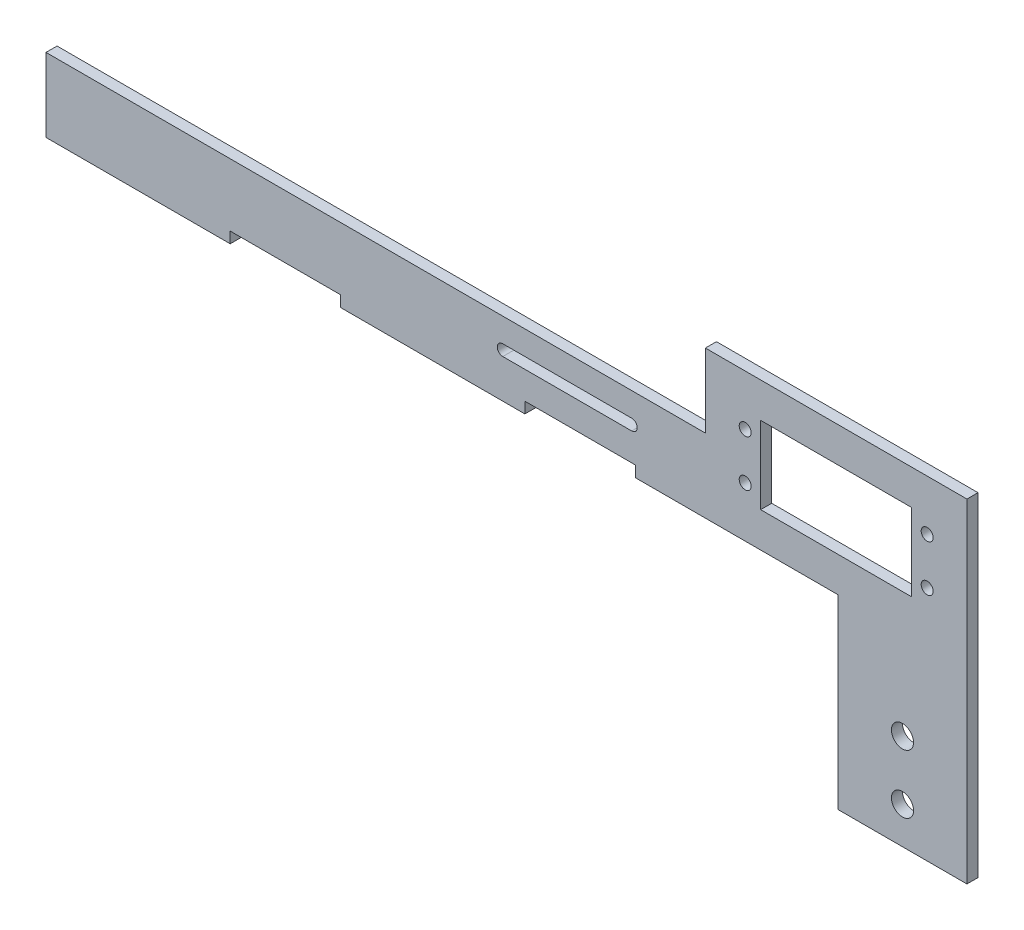
ISO-10303-21;
HEADER;
FILE_DESCRIPTION(('STEP AP214'),'2;1');
FILE_NAME('part.step','',(''),(''),'','','');
FILE_SCHEMA(('AUTOMOTIVE_DESIGN { 1 0 10303 214 1 1 1 1 }'));
ENDSEC;
DATA;
#1=APPLICATION_CONTEXT('core data for automotive mechanical design processes');
#2=APPLICATION_PROTOCOL_DEFINITION('international standard','automotive_design',2000,#1);
#3=PRODUCT_CONTEXT('',#1,'mechanical');
#4=PRODUCT('Part','Part','',(#3));
#5=PRODUCT_RELATED_PRODUCT_CATEGORY('part','',(#4));
#6=PRODUCT_DEFINITION_FORMATION('','',#4);
#7=PRODUCT_DEFINITION_CONTEXT('part definition',#1,'design');
#8=PRODUCT_DEFINITION('design','',#6,#7);
#9=PRODUCT_DEFINITION_SHAPE('','',#8);
#10=(LENGTH_UNIT() NAMED_UNIT(*) SI_UNIT(.MILLI.,.METRE.));
#11=(NAMED_UNIT(*) PLANE_ANGLE_UNIT() SI_UNIT($,.RADIAN.));
#12=(NAMED_UNIT(*) SI_UNIT($,.STERADIAN.) SOLID_ANGLE_UNIT());
#13=UNCERTAINTY_MEASURE_WITH_UNIT(LENGTH_MEASURE(1.E-05),#10,'distance_accuracy_value','');
#14=(GEOMETRIC_REPRESENTATION_CONTEXT(3) GLOBAL_UNCERTAINTY_ASSIGNED_CONTEXT((#13)) GLOBAL_UNIT_ASSIGNED_CONTEXT((#10,
#11,#12)) REPRESENTATION_CONTEXT('',''));
#15=CARTESIAN_POINT('',(0.,0.,0.));
#16=DIRECTION('',(0.,0.,1.));
#17=DIRECTION('',(1.,0.,0.));
#18=AXIS2_PLACEMENT_3D('',#15,#16,#17);
#19=CARTESIAN_POINT('',(0.,10.5,3.));
#20=DIRECTION('',(0.,1.,0.));
#21=DIRECTION('',(0.,0.,1.));
#22=AXIS2_PLACEMENT_3D('',#19,#20,#21);
#23=PLANE('',#22);
#24=DIRECTION('',(1.,0.,0.));
#25=VECTOR('',#24,1.);
#26=CARTESIAN_POINT('',(0.,10.5,0.));
#27=LINE('',#26,#25);
#28=CARTESIAN_POINT('',(194.,10.5,0.));
#29=VERTEX_POINT('',#28);
#30=CARTESIAN_POINT('',(235.,10.5,0.));
#31=VERTEX_POINT('',#30);
#32=EDGE_CURVE('E306',#29,#31,#27,.T.);
#33=ORIENTED_EDGE('',*,*,#32,.T.);
#34=DIRECTION('',(0.,0.,-1.));
#35=VECTOR('',#34,1.);
#36=CARTESIAN_POINT('',(235.,10.5,3.));
#37=LINE('',#36,#35);
#38=CARTESIAN_POINT('',(235.,10.5,3.));
#39=VERTEX_POINT('',#38);
#40=EDGE_CURVE('E11',#39,#31,#37,.T.);
#41=ORIENTED_EDGE('',*,*,#40,.F.);
#42=DIRECTION('',(1.,0.,0.));
#43=VECTOR('',#42,1.);
#44=CARTESIAN_POINT('',(0.,10.5,3.));
#45=LINE('',#44,#43);
#46=CARTESIAN_POINT('',(194.,10.5,3.));
#47=VERTEX_POINT('',#46);
#48=EDGE_CURVE('E211',#47,#39,#45,.T.);
#49=ORIENTED_EDGE('',*,*,#48,.F.);
#50=DIRECTION('',(0.,0.,-1.));
#51=VECTOR('',#50,1.);
#52=CARTESIAN_POINT('',(194.,10.5,3.));
#53=LINE('',#52,#51);
#54=EDGE_CURVE('E54',#47,#29,#53,.T.);
#55=ORIENTED_EDGE('',*,*,#54,.T.);
#56=EDGE_LOOP('',(#33,#41,#49,#55));
#57=FACE_BOUND('',#56,.T.);
#58=ADVANCED_FACE('F35',(#57),#23,.F.);
#59=CARTESIAN_POINT('',(235.,0.,3.));
#60=DIRECTION('',(1.,0.,0.));
#61=DIRECTION('',(0.,0.,-1.));
#62=AXIS2_PLACEMENT_3D('',#59,#60,#61);
#63=PLANE('',#62);
#64=DIRECTION('',(0.,-1.,0.));
#65=VECTOR('',#64,1.);
#66=CARTESIAN_POINT('',(235.,0.,0.));
#67=LINE('',#66,#65);
#68=CARTESIAN_POINT('',(235.,-10.5,0.));
#69=VERTEX_POINT('',#68);
#70=EDGE_CURVE('E217',#31,#69,#67,.T.);
#71=ORIENTED_EDGE('',*,*,#70,.T.);
#72=DIRECTION('',(0.,0.,-1.));
#73=VECTOR('',#72,1.);
#74=CARTESIAN_POINT('',(235.,-10.5,3.));
#75=LINE('',#74,#73);
#76=CARTESIAN_POINT('',(235.,-10.5,3.));
#77=VERTEX_POINT('',#76);
#78=EDGE_CURVE('E45',#77,#69,#75,.T.);
#79=ORIENTED_EDGE('',*,*,#78,.F.);
#80=DIRECTION('',(0.,-1.,0.));
#81=VECTOR('',#80,1.);
#82=CARTESIAN_POINT('',(235.,0.,3.));
#83=LINE('',#82,#81);
#84=EDGE_CURVE('E204',#39,#77,#83,.T.);
#85=ORIENTED_EDGE('',*,*,#84,.F.);
#86=ORIENTED_EDGE('',*,*,#40,.T.);
#87=EDGE_LOOP('',(#71,#79,#85,#86));
#88=FACE_BOUND('',#87,.T.);
#89=ADVANCED_FACE('F216',(#88),#63,.F.);
#90=CARTESIAN_POINT('',(0.,-10.5,3.));
#91=DIRECTION('',(0.,1.,0.));
#92=DIRECTION('',(0.,0.,1.));
#93=AXIS2_PLACEMENT_3D('',#90,#91,#92);
#94=PLANE('',#93);
#95=DIRECTION('',(1.,0.,0.));
#96=VECTOR('',#95,1.);
#97=CARTESIAN_POINT('',(0.,-10.5,0.));
#98=LINE('',#97,#96);
#99=CARTESIAN_POINT('',(194.,-10.5,0.));
#100=VERTEX_POINT('',#99);
#101=EDGE_CURVE('E309',#100,#69,#98,.T.);
#102=ORIENTED_EDGE('',*,*,#101,.F.);
#103=DIRECTION('',(0.,0.,-1.));
#104=VECTOR('',#103,1.);
#105=CARTESIAN_POINT('',(194.,-10.5,3.));
#106=LINE('',#105,#104);
#107=CARTESIAN_POINT('',(194.,-10.5,3.));
#108=VERTEX_POINT('',#107);
#109=EDGE_CURVE('E128',#108,#100,#106,.T.);
#110=ORIENTED_EDGE('',*,*,#109,.F.);
#111=DIRECTION('',(1.,0.,0.));
#112=VECTOR('',#111,1.);
#113=CARTESIAN_POINT('',(0.,-10.5,3.));
#114=LINE('',#113,#112);
#115=EDGE_CURVE('E210',#108,#77,#114,.T.);
#116=ORIENTED_EDGE('',*,*,#115,.T.);
#117=ORIENTED_EDGE('',*,*,#78,.T.);
#118=EDGE_LOOP('',(#102,#110,#116,#117));
#119=FACE_BOUND('',#118,.T.);
#120=ADVANCED_FACE('F221',(#119),#94,.T.);
#121=CARTESIAN_POINT('',(250.,0.,3.));
#122=DIRECTION('',(1.,0.,0.));
#123=DIRECTION('',(0.,0.,-1.));
#124=AXIS2_PLACEMENT_3D('',#121,#122,#123);
#125=PLANE('',#124);
#126=DIRECTION('',(0.,-1.,0.));
#127=VECTOR('',#126,1.);
#128=CARTESIAN_POINT('',(250.,0.,0.));
#129=LINE('',#128,#127);
#130=CARTESIAN_POINT('',(250.,20.,0.));
#131=VERTEX_POINT('',#130);
#132=CARTESIAN_POINT('',(250.,-70.5,0.));
#133=VERTEX_POINT('',#132);
#134=EDGE_CURVE('E258',#131,#133,#129,.T.);
#135=ORIENTED_EDGE('',*,*,#134,.F.);
#136=DIRECTION('',(0.,0.,-1.));
#137=VECTOR('',#136,1.);
#138=CARTESIAN_POINT('',(250.,20.,3.));
#139=LINE('',#138,#137);
#140=CARTESIAN_POINT('',(250.,20.,3.));
#141=VERTEX_POINT('',#140);
#142=EDGE_CURVE('E322',#141,#131,#139,.T.);
#143=ORIENTED_EDGE('',*,*,#142,.F.);
#144=DIRECTION('',(0.,-1.,0.));
#145=VECTOR('',#144,1.);
#146=CARTESIAN_POINT('',(250.,0.,3.));
#147=LINE('',#146,#145);
#148=CARTESIAN_POINT('',(250.,-70.5,3.));
#149=VERTEX_POINT('',#148);
#150=EDGE_CURVE('E399',#141,#149,#147,.T.);
#151=ORIENTED_EDGE('',*,*,#150,.T.);
#152=DIRECTION('',(0.,0.,-1.));
#153=VECTOR('',#152,1.);
#154=CARTESIAN_POINT('',(250.,-70.5,3.));
#155=LINE('',#154,#153);
#156=EDGE_CURVE('E324',#149,#133,#155,.T.);
#157=ORIENTED_EDGE('',*,*,#156,.T.);
#158=EDGE_LOOP('',(#135,#143,#151,#157));
#159=FACE_BOUND('',#158,.T.);
#160=ADVANCED_FACE('F452',(#159),#125,.T.);
#161=CARTESIAN_POINT('',(0.,20.,3.));
#162=DIRECTION('',(0.,-1.,0.));
#163=DIRECTION('',(1.,0.,0.));
#164=AXIS2_PLACEMENT_3D('',#161,#162,#163);
#165=PLANE('',#164);
#166=DIRECTION('',(-1.,0.,0.));
#167=VECTOR('',#166,1.);
#168=CARTESIAN_POINT('',(0.,20.,0.));
#169=LINE('',#168,#167);
#170=CARTESIAN_POINT('',(179.,20.,0.));
#171=VERTEX_POINT('',#170);
#172=EDGE_CURVE('E261',#131,#171,#169,.T.);
#173=ORIENTED_EDGE('',*,*,#172,.T.);
#174=DIRECTION('',(0.,0.,-1.));
#175=VECTOR('',#174,1.);
#176=CARTESIAN_POINT('',(179.,20.,3.));
#177=LINE('',#176,#175);
#178=CARTESIAN_POINT('',(179.,20.,3.));
#179=VERTEX_POINT('',#178);
#180=EDGE_CURVE('E357',#179,#171,#177,.T.);
#181=ORIENTED_EDGE('',*,*,#180,.F.);
#182=DIRECTION('',(-1.,0.,0.));
#183=VECTOR('',#182,1.);
#184=CARTESIAN_POINT('',(0.,20.,3.));
#185=LINE('',#184,#183);
#186=EDGE_CURVE('E402',#141,#179,#185,.T.);
#187=ORIENTED_EDGE('',*,*,#186,.F.);
#188=ORIENTED_EDGE('',*,*,#142,.T.);
#189=EDGE_LOOP('',(#173,#181,#187,#188));
#190=FACE_BOUND('',#189,.T.);
#191=ADVANCED_FACE('F457',(#190),#165,.F.);
#192=CARTESIAN_POINT('',(179.,0.,3.));
#193=DIRECTION('',(-1.,0.,0.));
#194=DIRECTION('',(0.,0.,1.));
#195=AXIS2_PLACEMENT_3D('',#192,#193,#194);
#196=PLANE('',#195);
#197=DIRECTION('',(0.,1.,0.));
#198=VECTOR('',#197,1.);
#199=CARTESIAN_POINT('',(179.,0.,0.));
#200=LINE('',#199,#198);
#201=CARTESIAN_POINT('',(179.,0.,0.));
#202=VERTEX_POINT('',#201);
#203=EDGE_CURVE('E264',#202,#171,#200,.T.);
#204=ORIENTED_EDGE('',*,*,#203,.F.);
#205=DIRECTION('',(0.,0.,-1.));
#206=VECTOR('',#205,1.);
#207=CARTESIAN_POINT('',(179.,0.,3.));
#208=LINE('',#207,#206);
#209=CARTESIAN_POINT('',(179.,0.,3.));
#210=VERTEX_POINT('',#209);
#211=EDGE_CURVE('E355',#210,#202,#208,.T.);
#212=ORIENTED_EDGE('',*,*,#211,.F.);
#213=DIRECTION('',(0.,1.,0.));
#214=VECTOR('',#213,1.);
#215=CARTESIAN_POINT('',(179.,0.,3.));
#216=LINE('',#215,#214);
#217=EDGE_CURVE('E404',#210,#179,#216,.T.);
#218=ORIENTED_EDGE('',*,*,#217,.T.);
#219=ORIENTED_EDGE('',*,*,#180,.T.);
#220=EDGE_LOOP('',(#204,#212,#218,#219));
#221=FACE_BOUND('',#220,.T.);
#222=ADVANCED_FACE('F507',(#221),#196,.T.);
#223=CARTESIAN_POINT('',(0.,0.,3.));
#224=DIRECTION('',(0.,1.,0.));
#225=DIRECTION('',(0.,0.,1.));
#226=AXIS2_PLACEMENT_3D('',#223,#224,#225);
#227=PLANE('',#226);
#228=DIRECTION('',(1.,0.,0.));
#229=VECTOR('',#228,1.);
#230=CARTESIAN_POINT('',(0.,0.,0.));
#231=LINE('',#230,#229);
#232=CARTESIAN_POINT('',(0.,0.,0.));
#233=VERTEX_POINT('',#232);
#234=EDGE_CURVE('E267',#233,#202,#231,.T.);
#235=ORIENTED_EDGE('',*,*,#234,.F.);
#236=DIRECTION('',(0.,0.,-1.));
#237=VECTOR('',#236,1.);
#238=CARTESIAN_POINT('',(0.,0.,3.));
#239=LINE('',#238,#237);
#240=CARTESIAN_POINT('',(0.,0.,3.));
#241=VERTEX_POINT('',#240);
#242=EDGE_CURVE('E353',#241,#233,#239,.T.);
#243=ORIENTED_EDGE('',*,*,#242,.F.);
#244=DIRECTION('',(1.,0.,0.));
#245=VECTOR('',#244,1.);
#246=CARTESIAN_POINT('',(0.,0.,3.));
#247=LINE('',#246,#245);
#248=EDGE_CURVE('E407',#241,#210,#247,.T.);
#249=ORIENTED_EDGE('',*,*,#248,.T.);
#250=ORIENTED_EDGE('',*,*,#211,.T.);
#251=EDGE_LOOP('',(#235,#243,#249,#250));
#252=FACE_BOUND('',#251,.T.);
#253=ADVANCED_FACE('F464',(#252),#227,.T.);
#254=CARTESIAN_POINT('',(0.,0.,3.));
#255=DIRECTION('',(-1.,0.,0.));
#256=DIRECTION('',(0.,0.,1.));
#257=AXIS2_PLACEMENT_3D('',#254,#255,#256);
#258=PLANE('',#257);
#259=DIRECTION('',(0.,1.,0.));
#260=VECTOR('',#259,1.);
#261=CARTESIAN_POINT('',(0.,0.,0.));
#262=LINE('',#261,#260);
#263=CARTESIAN_POINT('',(0.,-20.,0.));
#264=VERTEX_POINT('',#263);
#265=EDGE_CURVE('E270',#264,#233,#262,.T.);
#266=ORIENTED_EDGE('',*,*,#265,.F.);
#267=DIRECTION('',(0.,0.,-1.));
#268=VECTOR('',#267,1.);
#269=CARTESIAN_POINT('',(0.,-20.,3.));
#270=LINE('',#269,#268);
#271=CARTESIAN_POINT('',(0.,-20.,3.));
#272=VERTEX_POINT('',#271);
#273=EDGE_CURVE('E351',#272,#264,#270,.T.);
#274=ORIENTED_EDGE('',*,*,#273,.F.);
#275=DIRECTION('',(0.,1.,0.));
#276=VECTOR('',#275,1.);
#277=CARTESIAN_POINT('',(0.,0.,3.));
#278=LINE('',#277,#276);
#279=EDGE_CURVE('E410',#272,#241,#278,.T.);
#280=ORIENTED_EDGE('',*,*,#279,.T.);
#281=ORIENTED_EDGE('',*,*,#242,.T.);
#282=EDGE_LOOP('',(#266,#274,#280,#281));
#283=FACE_BOUND('',#282,.T.);
#284=ADVANCED_FACE('F468',(#283),#258,.T.);
#285=CARTESIAN_POINT('',(0.,-20.,3.));
#286=DIRECTION('',(0.,-1.,0.));
#287=DIRECTION('',(1.,0.,0.));
#288=AXIS2_PLACEMENT_3D('',#285,#286,#287);
#289=PLANE('',#288);
#290=DIRECTION('',(-1.,0.,0.));
#291=VECTOR('',#290,1.);
#292=CARTESIAN_POINT('',(0.,-20.,0.));
#293=LINE('',#292,#291);
#294=CARTESIAN_POINT('',(50.,-20.,0.));
#295=VERTEX_POINT('',#294);
#296=EDGE_CURVE('E273',#295,#264,#293,.T.);
#297=ORIENTED_EDGE('',*,*,#296,.F.);
#298=DIRECTION('',(0.,0.,-1.));
#299=VECTOR('',#298,1.);
#300=CARTESIAN_POINT('',(50.,-20.,3.));
#301=LINE('',#300,#299);
#302=CARTESIAN_POINT('',(50.,-20.,3.));
#303=VERTEX_POINT('',#302);
#304=EDGE_CURVE('E349',#303,#295,#301,.T.);
#305=ORIENTED_EDGE('',*,*,#304,.F.);
#306=DIRECTION('',(-1.,0.,0.));
#307=VECTOR('',#306,1.);
#308=CARTESIAN_POINT('',(0.,-20.,3.));
#309=LINE('',#308,#307);
#310=EDGE_CURVE('E413',#303,#272,#309,.T.);
#311=ORIENTED_EDGE('',*,*,#310,.T.);
#312=ORIENTED_EDGE('',*,*,#273,.T.);
#313=EDGE_LOOP('',(#297,#305,#311,#312));
#314=FACE_BOUND('',#313,.T.);
#315=ADVANCED_FACE('F472',(#314),#289,.T.);
#316=CARTESIAN_POINT('',(50.,0.,3.));
#317=DIRECTION('',(-1.,0.,0.));
#318=DIRECTION('',(0.,0.,1.));
#319=AXIS2_PLACEMENT_3D('',#316,#317,#318);
#320=PLANE('',#319);
#321=DIRECTION('',(0.,1.,0.));
#322=VECTOR('',#321,1.);
#323=CARTESIAN_POINT('',(50.,0.,0.));
#324=LINE('',#323,#322);
#325=CARTESIAN_POINT('',(50.,-17.,0.));
#326=VERTEX_POINT('',#325);
#327=EDGE_CURVE('E276',#295,#326,#324,.T.);
#328=ORIENTED_EDGE('',*,*,#327,.T.);
#329=DIRECTION('',(0.,0.,-1.));
#330=VECTOR('',#329,1.);
#331=CARTESIAN_POINT('',(50.,-17.,3.));
#332=LINE('',#331,#330);
#333=CARTESIAN_POINT('',(50.,-17.,3.));
#334=VERTEX_POINT('',#333);
#335=EDGE_CURVE('E346',#334,#326,#332,.T.);
#336=ORIENTED_EDGE('',*,*,#335,.F.);
#337=DIRECTION('',(0.,1.,0.));
#338=VECTOR('',#337,1.);
#339=CARTESIAN_POINT('',(50.,0.,3.));
#340=LINE('',#339,#338);
#341=EDGE_CURVE('E416',#303,#334,#340,.T.);
#342=ORIENTED_EDGE('',*,*,#341,.F.);
#343=ORIENTED_EDGE('',*,*,#304,.T.);
#344=EDGE_LOOP('',(#328,#336,#342,#343));
#345=FACE_BOUND('',#344,.T.);
#346=ADVANCED_FACE('F477',(#345),#320,.F.);
#347=CARTESIAN_POINT('',(0.,-17.,3.));
#348=DIRECTION('',(0.,1.,0.));
#349=DIRECTION('',(0.,0.,1.));
#350=AXIS2_PLACEMENT_3D('',#347,#348,#349);
#351=PLANE('',#350);
#352=DIRECTION('',(1.,0.,0.));
#353=VECTOR('',#352,1.);
#354=CARTESIAN_POINT('',(0.,-17.,0.));
#355=LINE('',#354,#353);
#356=CARTESIAN_POINT('',(80.,-17.,0.));
#357=VERTEX_POINT('',#356);
#358=EDGE_CURVE('E279',#326,#357,#355,.T.);
#359=ORIENTED_EDGE('',*,*,#358,.T.);
#360=DIRECTION('',(0.,0.,-1.));
#361=VECTOR('',#360,1.);
#362=CARTESIAN_POINT('',(80.,-17.,3.));
#363=LINE('',#362,#361);
#364=CARTESIAN_POINT('',(80.,-17.,3.));
#365=VERTEX_POINT('',#364);
#366=EDGE_CURVE('E343',#365,#357,#363,.T.);
#367=ORIENTED_EDGE('',*,*,#366,.F.);
#368=DIRECTION('',(1.,0.,0.));
#369=VECTOR('',#368,1.);
#370=CARTESIAN_POINT('',(0.,-17.,3.));
#371=LINE('',#370,#369);
#372=EDGE_CURVE('E419',#334,#365,#371,.T.);
#373=ORIENTED_EDGE('',*,*,#372,.F.);
#374=ORIENTED_EDGE('',*,*,#335,.T.);
#375=EDGE_LOOP('',(#359,#367,#373,#374));
#376=FACE_BOUND('',#375,.T.);
#377=ADVANCED_FACE('F482',(#376),#351,.F.);
#378=CARTESIAN_POINT('',(80.,0.,3.));
#379=DIRECTION('',(1.,0.,0.));
#380=DIRECTION('',(0.,0.,-1.));
#381=AXIS2_PLACEMENT_3D('',#378,#379,#380);
#382=PLANE('',#381);
#383=DIRECTION('',(0.,-1.,0.));
#384=VECTOR('',#383,1.);
#385=CARTESIAN_POINT('',(80.,0.,0.));
#386=LINE('',#385,#384);
#387=CARTESIAN_POINT('',(80.,-20.,0.));
#388=VERTEX_POINT('',#387);
#389=EDGE_CURVE('E282',#357,#388,#386,.T.);
#390=ORIENTED_EDGE('',*,*,#389,.T.);
#391=DIRECTION('',(0.,0.,-1.));
#392=VECTOR('',#391,1.);
#393=CARTESIAN_POINT('',(80.,-20.,3.));
#394=LINE('',#393,#392);
#395=CARTESIAN_POINT('',(80.,-20.,3.));
#396=VERTEX_POINT('',#395);
#397=EDGE_CURVE('E341',#396,#388,#394,.T.);
#398=ORIENTED_EDGE('',*,*,#397,.F.);
#399=DIRECTION('',(0.,-1.,0.));
#400=VECTOR('',#399,1.);
#401=CARTESIAN_POINT('',(80.,0.,3.));
#402=LINE('',#401,#400);
#403=EDGE_CURVE('E422',#365,#396,#402,.T.);
#404=ORIENTED_EDGE('',*,*,#403,.F.);
#405=ORIENTED_EDGE('',*,*,#366,.T.);
#406=EDGE_LOOP('',(#390,#398,#404,#405));
#407=FACE_BOUND('',#406,.T.);
#408=ADVANCED_FACE('F484',(#407),#382,.F.);
#409=CARTESIAN_POINT('',(0.,-20.,3.));
#410=DIRECTION('',(0.,-1.,0.));
#411=DIRECTION('',(1.,0.,0.));
#412=AXIS2_PLACEMENT_3D('',#409,#410,#411);
#413=PLANE('',#412);
#414=DIRECTION('',(-1.,0.,0.));
#415=VECTOR('',#414,1.);
#416=CARTESIAN_POINT('',(0.,-20.,0.));
#417=LINE('',#416,#415);
#418=CARTESIAN_POINT('',(130.,-20.,0.));
#419=VERTEX_POINT('',#418);
#420=EDGE_CURVE('E285',#419,#388,#417,.T.);
#421=ORIENTED_EDGE('',*,*,#420,.F.);
#422=DIRECTION('',(0.,0.,-1.));
#423=VECTOR('',#422,1.);
#424=CARTESIAN_POINT('',(130.,-20.,3.));
#425=LINE('',#424,#423);
#426=CARTESIAN_POINT('',(130.,-20.,3.));
#427=VERTEX_POINT('',#426);
#428=EDGE_CURVE('E339',#427,#419,#425,.T.);
#429=ORIENTED_EDGE('',*,*,#428,.F.);
#430=DIRECTION('',(-1.,0.,0.));
#431=VECTOR('',#430,1.);
#432=CARTESIAN_POINT('',(0.,-20.,3.));
#433=LINE('',#432,#431);
#434=EDGE_CURVE('E424',#427,#396,#433,.T.);
#435=ORIENTED_EDGE('',*,*,#434,.T.);
#436=ORIENTED_EDGE('',*,*,#397,.T.);
#437=EDGE_LOOP('',(#421,#429,#435,#436));
#438=FACE_BOUND('',#437,.T.);
#439=ADVANCED_FACE('F487',(#438),#413,.T.);
#440=CARTESIAN_POINT('',(130.,0.,3.));
#441=DIRECTION('',(-1.,0.,0.));
#442=DIRECTION('',(0.,0.,1.));
#443=AXIS2_PLACEMENT_3D('',#440,#441,#442);
#444=PLANE('',#443);
#445=DIRECTION('',(0.,1.,0.));
#446=VECTOR('',#445,1.);
#447=CARTESIAN_POINT('',(130.,0.,0.));
#448=LINE('',#447,#446);
#449=CARTESIAN_POINT('',(130.,-17.,0.));
#450=VERTEX_POINT('',#449);
#451=EDGE_CURVE('E288',#419,#450,#448,.T.);
#452=ORIENTED_EDGE('',*,*,#451,.T.);
#453=DIRECTION('',(0.,0.,-1.));
#454=VECTOR('',#453,1.);
#455=CARTESIAN_POINT('',(130.,-17.,3.));
#456=LINE('',#455,#454);
#457=CARTESIAN_POINT('',(130.,-17.,3.));
#458=VERTEX_POINT('',#457);
#459=EDGE_CURVE('E336',#458,#450,#456,.T.);
#460=ORIENTED_EDGE('',*,*,#459,.F.);
#461=DIRECTION('',(0.,1.,0.));
#462=VECTOR('',#461,1.);
#463=CARTESIAN_POINT('',(130.,0.,3.));
#464=LINE('',#463,#462);
#465=EDGE_CURVE('E427',#427,#458,#464,.T.);
#466=ORIENTED_EDGE('',*,*,#465,.F.);
#467=ORIENTED_EDGE('',*,*,#428,.T.);
#468=EDGE_LOOP('',(#452,#460,#466,#467));
#469=FACE_BOUND('',#468,.T.);
#470=ADVANCED_FACE('F492',(#469),#444,.F.);
#471=CARTESIAN_POINT('',(0.,-17.,3.));
#472=DIRECTION('',(0.,1.,0.));
#473=DIRECTION('',(0.,0.,1.));
#474=AXIS2_PLACEMENT_3D('',#471,#472,#473);
#475=PLANE('',#474);
#476=DIRECTION('',(1.,0.,0.));
#477=VECTOR('',#476,1.);
#478=CARTESIAN_POINT('',(0.,-17.,0.));
#479=LINE('',#478,#477);
#480=CARTESIAN_POINT('',(160.,-17.,0.));
#481=VERTEX_POINT('',#480);
#482=EDGE_CURVE('E291',#450,#481,#479,.T.);
#483=ORIENTED_EDGE('',*,*,#482,.T.);
#484=DIRECTION('',(0.,0.,-1.));
#485=VECTOR('',#484,1.);
#486=CARTESIAN_POINT('',(160.,-17.,3.));
#487=LINE('',#486,#485);
#488=CARTESIAN_POINT('',(160.,-17.,3.));
#489=VERTEX_POINT('',#488);
#490=EDGE_CURVE('E333',#489,#481,#487,.T.);
#491=ORIENTED_EDGE('',*,*,#490,.F.);
#492=DIRECTION('',(1.,0.,0.));
#493=VECTOR('',#492,1.);
#494=CARTESIAN_POINT('',(0.,-17.,3.));
#495=LINE('',#494,#493);
#496=EDGE_CURVE('E430',#458,#489,#495,.T.);
#497=ORIENTED_EDGE('',*,*,#496,.F.);
#498=ORIENTED_EDGE('',*,*,#459,.T.);
#499=EDGE_LOOP('',(#483,#491,#497,#498));
#500=FACE_BOUND('',#499,.T.);
#501=ADVANCED_FACE('F495',(#500),#475,.F.);
#502=CARTESIAN_POINT('',(160.,0.,3.));
#503=DIRECTION('',(1.,0.,0.));
#504=DIRECTION('',(0.,0.,-1.));
#505=AXIS2_PLACEMENT_3D('',#502,#503,#504);
#506=PLANE('',#505);
#507=DIRECTION('',(0.,-1.,0.));
#508=VECTOR('',#507,1.);
#509=CARTESIAN_POINT('',(160.,0.,0.));
#510=LINE('',#509,#508);
#511=CARTESIAN_POINT('',(160.,-20.,0.));
#512=VERTEX_POINT('',#511);
#513=EDGE_CURVE('E294',#481,#512,#510,.T.);
#514=ORIENTED_EDGE('',*,*,#513,.T.);
#515=DIRECTION('',(0.,0.,-1.));
#516=VECTOR('',#515,1.);
#517=CARTESIAN_POINT('',(160.,-20.,3.));
#518=LINE('',#517,#516);
#519=CARTESIAN_POINT('',(160.,-20.,3.));
#520=VERTEX_POINT('',#519);
#521=EDGE_CURVE('E331',#520,#512,#518,.T.);
#522=ORIENTED_EDGE('',*,*,#521,.F.);
#523=DIRECTION('',(0.,-1.,0.));
#524=VECTOR('',#523,1.);
#525=CARTESIAN_POINT('',(160.,0.,3.));
#526=LINE('',#525,#524);
#527=EDGE_CURVE('E433',#489,#520,#526,.T.);
#528=ORIENTED_EDGE('',*,*,#527,.F.);
#529=ORIENTED_EDGE('',*,*,#490,.T.);
#530=EDGE_LOOP('',(#514,#522,#528,#529));
#531=FACE_BOUND('',#530,.T.);
#532=ADVANCED_FACE('F497',(#531),#506,.F.);
#533=CARTESIAN_POINT('',(0.,-20.,3.));
#534=DIRECTION('',(0.,-1.,0.));
#535=DIRECTION('',(1.,0.,0.));
#536=AXIS2_PLACEMENT_3D('',#533,#534,#535);
#537=PLANE('',#536);
#538=DIRECTION('',(-1.,0.,0.));
#539=VECTOR('',#538,1.);
#540=CARTESIAN_POINT('',(0.,-20.,0.));
#541=LINE('',#540,#539);
#542=CARTESIAN_POINT('',(215.,-20.,0.));
#543=VERTEX_POINT('',#542);
#544=EDGE_CURVE('E297',#543,#512,#541,.T.);
#545=ORIENTED_EDGE('',*,*,#544,.F.);
#546=DIRECTION('',(0.,0.,-1.));
#547=VECTOR('',#546,1.);
#548=CARTESIAN_POINT('',(215.,-20.,3.));
#549=LINE('',#548,#547);
#550=CARTESIAN_POINT('',(215.,-20.,3.));
#551=VERTEX_POINT('',#550);
#552=EDGE_CURVE('E329',#551,#543,#549,.T.);
#553=ORIENTED_EDGE('',*,*,#552,.F.);
#554=DIRECTION('',(-1.,0.,0.));
#555=VECTOR('',#554,1.);
#556=CARTESIAN_POINT('',(0.,-20.,3.));
#557=LINE('',#556,#555);
#558=EDGE_CURVE('E435',#551,#520,#557,.T.);
#559=ORIENTED_EDGE('',*,*,#558,.T.);
#560=ORIENTED_EDGE('',*,*,#521,.T.);
#561=EDGE_LOOP('',(#545,#553,#559,#560));
#562=FACE_BOUND('',#561,.T.);
#563=ADVANCED_FACE('F501',(#562),#537,.T.);
#564=CARTESIAN_POINT('',(215.,0.,3.));
#565=DIRECTION('',(1.,0.,0.));
#566=DIRECTION('',(0.,0.,-1.));
#567=AXIS2_PLACEMENT_3D('',#564,#565,#566);
#568=PLANE('',#567);
#569=DIRECTION('',(0.,-1.,0.));
#570=VECTOR('',#569,1.);
#571=CARTESIAN_POINT('',(215.,0.,0.));
#572=LINE('',#571,#570);
#573=CARTESIAN_POINT('',(215.,-70.5,0.));
#574=VERTEX_POINT('',#573);
#575=EDGE_CURVE('E300',#543,#574,#572,.T.);
#576=ORIENTED_EDGE('',*,*,#575,.T.);
#577=DIRECTION('',(0.,0.,-1.));
#578=VECTOR('',#577,1.);
#579=CARTESIAN_POINT('',(215.,-70.5,3.));
#580=LINE('',#579,#578);
#581=CARTESIAN_POINT('',(215.,-70.5,3.));
#582=VERTEX_POINT('',#581);
#583=EDGE_CURVE('E326',#582,#574,#580,.T.);
#584=ORIENTED_EDGE('',*,*,#583,.F.);
#585=DIRECTION('',(0.,-1.,0.));
#586=VECTOR('',#585,1.);
#587=CARTESIAN_POINT('',(215.,0.,3.));
#588=LINE('',#587,#586);
#589=EDGE_CURVE('E438',#551,#582,#588,.T.);
#590=ORIENTED_EDGE('',*,*,#589,.F.);
#591=ORIENTED_EDGE('',*,*,#552,.T.);
#592=EDGE_LOOP('',(#576,#584,#590,#591));
#593=FACE_BOUND('',#592,.T.);
#594=ADVANCED_FACE('F504',(#593),#568,.F.);
#595=CARTESIAN_POINT('',(159.,-8.,3.));
#596=DIRECTION('',(0.,0.,-1.));
#597=DIRECTION('',(-1.,0.,0.));
#598=AXIS2_PLACEMENT_3D('',#595,#596,#597);
#599=CYLINDRICAL_SURFACE('',#598,1.5);
#600=CARTESIAN_POINT('',(159.,-8.,0.));
#601=DIRECTION('',(0.,0.,1.));
#602=DIRECTION('',(1.,0.,0.));
#603=AXIS2_PLACEMENT_3D('',#600,#601,#602);
#604=CIRCLE('',#603,1.5);
#605=CARTESIAN_POINT('',(159.,-9.5,0.));
#606=VERTEX_POINT('',#605);
#607=CARTESIAN_POINT('',(159.,-6.5,0.));
#608=VERTEX_POINT('',#607);
#609=EDGE_CURVE('E240',#606,#608,#604,.T.);
#610=ORIENTED_EDGE('',*,*,#609,.F.);
#611=DIRECTION('',(0.,0.,-1.));
#612=VECTOR('',#611,1.);
#613=CARTESIAN_POINT('',(159.,-9.5,3.));
#614=LINE('',#613,#612);
#615=CARTESIAN_POINT('',(159.,-9.5,3.));
#616=VERTEX_POINT('',#615);
#617=EDGE_CURVE('E39',#616,#606,#614,.T.);
#618=ORIENTED_EDGE('',*,*,#617,.F.);
#619=CARTESIAN_POINT('',(159.,-8.,3.));
#620=DIRECTION('',(0.,0.,1.));
#621=DIRECTION('',(1.,0.,0.));
#622=AXIS2_PLACEMENT_3D('',#619,#620,#621);
#623=CIRCLE('',#622,1.5);
#624=CARTESIAN_POINT('',(159.,-6.5,3.));
#625=VERTEX_POINT('',#624);
#626=EDGE_CURVE('E390',#616,#625,#623,.T.);
#627=ORIENTED_EDGE('',*,*,#626,.T.);
#628=DIRECTION('',(0.,0.,-1.));
#629=VECTOR('',#628,1.);
#630=CARTESIAN_POINT('',(159.,-6.5,3.));
#631=LINE('',#630,#629);
#632=EDGE_CURVE('E233',#625,#608,#631,.T.);
#633=ORIENTED_EDGE('',*,*,#632,.T.);
#634=EDGE_LOOP('',(#610,#618,#627,#633));
#635=FACE_BOUND('',#634,.T.);
#636=ADVANCED_FACE('F372',(#635),#599,.F.);
#637=CARTESIAN_POINT('',(0.,-9.5,3.));
#638=DIRECTION('',(0.,1.,0.));
#639=DIRECTION('',(0.,0.,1.));
#640=AXIS2_PLACEMENT_3D('',#637,#638,#639);
#641=PLANE('',#640);
#642=DIRECTION('',(1.,0.,0.));
#643=VECTOR('',#642,1.);
#644=CARTESIAN_POINT('',(0.,-9.5,0.));
#645=LINE('',#644,#643);
#646=CARTESIAN_POINT('',(124.,-9.5,0.));
#647=VERTEX_POINT('',#646);
#648=EDGE_CURVE('E243',#647,#606,#645,.T.);
#649=ORIENTED_EDGE('',*,*,#648,.F.);
#650=DIRECTION('',(0.,0.,-1.));
#651=VECTOR('',#650,1.);
#652=CARTESIAN_POINT('',(124.,-9.5,3.));
#653=LINE('',#652,#651);
#654=CARTESIAN_POINT('',(124.,-9.5,3.));
#655=VERTEX_POINT('',#654);
#656=EDGE_CURVE('E362',#655,#647,#653,.T.);
#657=ORIENTED_EDGE('',*,*,#656,.F.);
#658=DIRECTION('',(1.,0.,0.));
#659=VECTOR('',#658,1.);
#660=CARTESIAN_POINT('',(0.,-9.5,3.));
#661=LINE('',#660,#659);
#662=EDGE_CURVE('E371',#655,#616,#661,.T.);
#663=ORIENTED_EDGE('',*,*,#662,.T.);
#664=ORIENTED_EDGE('',*,*,#617,.T.);
#665=EDGE_LOOP('',(#649,#657,#663,#664));
#666=FACE_BOUND('',#665,.T.);
#667=ADVANCED_FACE('F369',(#666),#641,.T.);
#668=CARTESIAN_POINT('',(124.,-8.,3.));
#669=DIRECTION('',(0.,0.,-1.));
#670=DIRECTION('',(-1.,0.,0.));
#671=AXIS2_PLACEMENT_3D('',#668,#669,#670);
#672=CYLINDRICAL_SURFACE('',#671,1.5);
#673=CARTESIAN_POINT('',(124.,-8.,0.));
#674=DIRECTION('',(0.,0.,1.));
#675=DIRECTION('',(1.,0.,0.));
#676=AXIS2_PLACEMENT_3D('',#673,#674,#675);
#677=CIRCLE('',#676,1.5);
#678=CARTESIAN_POINT('',(124.,-6.5,0.));
#679=VERTEX_POINT('',#678);
#680=EDGE_CURVE('E246',#679,#647,#677,.T.);
#681=ORIENTED_EDGE('',*,*,#680,.F.);
#682=DIRECTION('',(0.,0.,-1.));
#683=VECTOR('',#682,1.);
#684=CARTESIAN_POINT('',(124.,-6.5,3.));
#685=LINE('',#684,#683);
#686=CARTESIAN_POINT('',(124.,-6.5,3.));
#687=VERTEX_POINT('',#686);
#688=EDGE_CURVE('E361',#687,#679,#685,.T.);
#689=ORIENTED_EDGE('',*,*,#688,.F.);
#690=CARTESIAN_POINT('',(124.,-8.,3.));
#691=DIRECTION('',(0.,0.,1.));
#692=DIRECTION('',(1.,0.,0.));
#693=AXIS2_PLACEMENT_3D('',#690,#691,#692);
#694=CIRCLE('',#693,1.5);
#695=EDGE_CURVE('E381',#687,#655,#694,.T.);
#696=ORIENTED_EDGE('',*,*,#695,.T.);
#697=ORIENTED_EDGE('',*,*,#656,.T.);
#698=EDGE_LOOP('',(#681,#689,#696,#697));
#699=FACE_BOUND('',#698,.T.);
#700=ADVANCED_FACE('F378',(#699),#672,.F.);
#701=CARTESIAN_POINT('',(239.2,-6.3,3.));
#702=DIRECTION('',(0.,0.,-1.));
#703=DIRECTION('',(-1.,0.,0.));
#704=AXIS2_PLACEMENT_3D('',#701,#702,#703);
#705=CYLINDRICAL_SURFACE('',#704,1.62499999999998);
#706=CARTESIAN_POINT('',(239.2,-6.3,3.));
#707=DIRECTION('',(0.,0.,1.));
#708=DIRECTION('',(1.,0.,0.));
#709=AXIS2_PLACEMENT_3D('',#706,#707,#708);
#710=CIRCLE('',#709,1.62499999999998);
#711=CARTESIAN_POINT('',(240.825,-6.3,3.));
#712=VERTEX_POINT('',#711);
#713=EDGE_CURVE('E224',#712,#712,#710,.T.);
#714=ORIENTED_EDGE('',*,*,#713,.T.);
#715=EDGE_LOOP('',(#714));
#716=FACE_BOUND('',#715,.T.);
#717=CARTESIAN_POINT('',(239.2,-6.3,0.));
#718=DIRECTION('',(0.,0.,1.));
#719=DIRECTION('',(1.,0.,0.));
#720=AXIS2_PLACEMENT_3D('',#717,#718,#719);
#721=CIRCLE('',#720,1.62499999999998);
#722=CARTESIAN_POINT('',(240.825,-6.3,0.));
#723=VERTEX_POINT('',#722);
#724=EDGE_CURVE('E314',#723,#723,#721,.T.);
#725=ORIENTED_EDGE('',*,*,#724,.F.);
#726=EDGE_LOOP('',(#725));
#727=FACE_BOUND('',#726,.T.);
#728=ADVANCED_FACE('F611',(#716,#727),#705,.F.);
#729=CARTESIAN_POINT('',(194.,0.,3.));
#730=DIRECTION('',(1.,0.,0.));
#731=DIRECTION('',(0.,0.,-1.));
#732=AXIS2_PLACEMENT_3D('',#729,#730,#731);
#733=PLANE('',#732);
#734=DIRECTION('',(0.,-1.,0.));
#735=VECTOR('',#734,1.);
#736=CARTESIAN_POINT('',(194.,0.,0.));
#737=LINE('',#736,#735);
#738=EDGE_CURVE('E311',#29,#100,#737,.T.);
#739=ORIENTED_EDGE('',*,*,#738,.F.);
#740=ORIENTED_EDGE('',*,*,#54,.F.);
#741=DIRECTION('',(0.,-1.,0.));
#742=VECTOR('',#741,1.);
#743=CARTESIAN_POINT('',(194.,0.,3.));
#744=LINE('',#743,#742);
#745=EDGE_CURVE('E222',#47,#108,#744,.T.);
#746=ORIENTED_EDGE('',*,*,#745,.T.);
#747=ORIENTED_EDGE('',*,*,#109,.T.);
#748=EDGE_LOOP('',(#739,#740,#746,#747));
#749=FACE_BOUND('',#748,.T.);
#750=ADVANCED_FACE('F527',(#749),#733,.T.);
#751=CARTESIAN_POINT('',(0.,-70.5,3.));
#752=DIRECTION('',(0.,1.,0.));
#753=DIRECTION('',(0.,0.,1.));
#754=AXIS2_PLACEMENT_3D('',#751,#752,#753);
#755=PLANE('',#754);
#756=DIRECTION('',(1.,0.,0.));
#757=VECTOR('',#756,1.);
#758=CARTESIAN_POINT('',(0.,-70.5,0.));
#759=LINE('',#758,#757);
#760=EDGE_CURVE('E303',#574,#133,#759,.T.);
#761=ORIENTED_EDGE('',*,*,#760,.T.);
#762=ORIENTED_EDGE('',*,*,#156,.F.);
#763=DIRECTION('',(1.,0.,0.));
#764=VECTOR('',#763,1.);
#765=CARTESIAN_POINT('',(0.,-70.5,3.));
#766=LINE('',#765,#764);
#767=EDGE_CURVE('E441',#582,#149,#766,.T.);
#768=ORIENTED_EDGE('',*,*,#767,.F.);
#769=ORIENTED_EDGE('',*,*,#583,.T.);
#770=EDGE_LOOP('',(#761,#762,#768,#769));
#771=FACE_BOUND('',#770,.T.);
#772=ADVANCED_FACE('F449',(#771),#755,.F.);
#773=CARTESIAN_POINT('',(189.8,6.3,3.));
#774=DIRECTION('',(0.,0.,-1.));
#775=DIRECTION('',(-1.,0.,0.));
#776=AXIS2_PLACEMENT_3D('',#773,#774,#775);
#777=CYLINDRICAL_SURFACE('',#776,1.62499999999998);
#778=CARTESIAN_POINT('',(189.8,6.3,3.));
#779=DIRECTION('',(0.,0.,1.));
#780=DIRECTION('',(1.,0.,0.));
#781=AXIS2_PLACEMENT_3D('',#778,#779,#780);
#782=CIRCLE('',#781,1.62499999999998);
#783=CARTESIAN_POINT('',(191.425,6.3,3.));
#784=VERTEX_POINT('',#783);
#785=EDGE_CURVE('E396',#784,#784,#782,.T.);
#786=ORIENTED_EDGE('',*,*,#785,.T.);
#787=EDGE_LOOP('',(#786));
#788=FACE_BOUND('',#787,.T.);
#789=CARTESIAN_POINT('',(189.8,6.3,0.));
#790=DIRECTION('',(0.,0.,1.));
#791=DIRECTION('',(1.,0.,0.));
#792=AXIS2_PLACEMENT_3D('',#789,#790,#791);
#793=CIRCLE('',#792,1.62499999999998);
#794=CARTESIAN_POINT('',(191.425,6.3,0.));
#795=VERTEX_POINT('',#794);
#796=EDGE_CURVE('E255',#795,#795,#793,.T.);
#797=ORIENTED_EDGE('',*,*,#796,.F.);
#798=EDGE_LOOP('',(#797));
#799=FACE_BOUND('',#798,.T.);
#800=ADVANCED_FACE('F526',(#788,#799),#777,.F.);
#801=CARTESIAN_POINT('',(239.2,6.3,3.));
#802=DIRECTION('',(0.,0.,-1.));
#803=DIRECTION('',(-1.,0.,0.));
#804=AXIS2_PLACEMENT_3D('',#801,#802,#803);
#805=CYLINDRICAL_SURFACE('',#804,1.62499999999998);
#806=CARTESIAN_POINT('',(239.2,6.3,3.));
#807=DIRECTION('',(0.,0.,1.));
#808=DIRECTION('',(1.,0.,0.));
#809=AXIS2_PLACEMENT_3D('',#806,#807,#808);
#810=CIRCLE('',#809,1.62499999999998);
#811=CARTESIAN_POINT('',(240.825,6.3,3.));
#812=VERTEX_POINT('',#811);
#813=EDGE_CURVE('E386',#812,#812,#810,.F.);
#814=ORIENTED_EDGE('',*,*,#813,.F.);
#815=EDGE_LOOP('',(#814));
#816=FACE_BOUND('',#815,.T.);
#817=CARTESIAN_POINT('',(239.2,6.3,0.));
#818=DIRECTION('',(0.,0.,1.));
#819=DIRECTION('',(1.,0.,0.));
#820=AXIS2_PLACEMENT_3D('',#817,#818,#819);
#821=CIRCLE('',#820,1.62499999999998);
#822=CARTESIAN_POINT('',(240.825,6.3,0.));
#823=VERTEX_POINT('',#822);
#824=EDGE_CURVE('E252',#823,#823,#821,.F.);
#825=ORIENTED_EDGE('',*,*,#824,.T.);
#826=EDGE_LOOP('',(#825));
#827=FACE_BOUND('',#826,.T.);
#828=ADVANCED_FACE('F635',(#816,#827),#805,.F.);
#829=CARTESIAN_POINT('',(0.,-6.5,3.));
#830=DIRECTION('',(0.,1.,0.));
#831=DIRECTION('',(0.,0.,1.));
#832=AXIS2_PLACEMENT_3D('',#829,#830,#831);
#833=PLANE('',#832);
#834=DIRECTION('',(1.,0.,0.));
#835=VECTOR('',#834,1.);
#836=CARTESIAN_POINT('',(0.,-6.5,0.));
#837=LINE('',#836,#835);
#838=EDGE_CURVE('E249',#679,#608,#837,.T.);
#839=ORIENTED_EDGE('',*,*,#838,.T.);
#840=ORIENTED_EDGE('',*,*,#632,.F.);
#841=DIRECTION('',(1.,0.,0.));
#842=VECTOR('',#841,1.);
#843=CARTESIAN_POINT('',(0.,-6.5,3.));
#844=LINE('',#843,#842);
#845=EDGE_CURVE('E383',#687,#625,#844,.T.);
#846=ORIENTED_EDGE('',*,*,#845,.F.);
#847=ORIENTED_EDGE('',*,*,#688,.T.);
#848=EDGE_LOOP('',(#839,#840,#846,#847));
#849=FACE_BOUND('',#848,.T.);
#850=ADVANCED_FACE('F384',(#849),#833,.F.);
#851=CARTESIAN_POINT('',(232.5,-60.5,3.));
#852=DIRECTION('',(0.,0.,-1.));
#853=DIRECTION('',(-1.,0.,0.));
#854=AXIS2_PLACEMENT_3D('',#851,#852,#853);
#855=CYLINDRICAL_SURFACE('',#854,2.99999999999999);
#856=CARTESIAN_POINT('',(232.5,-60.5,3.));
#857=DIRECTION('',(0.,0.,1.));
#858=DIRECTION('',(1.,0.,0.));
#859=AXIS2_PLACEMENT_3D('',#856,#857,#858);
#860=CIRCLE('',#859,2.99999999999999);
#861=CARTESIAN_POINT('',(235.5,-60.5,3.));
#862=VERTEX_POINT('',#861);
#863=EDGE_CURVE('E789',#862,#862,#860,.T.);
#864=ORIENTED_EDGE('',*,*,#863,.T.);
#865=EDGE_LOOP('',(#864));
#866=FACE_BOUND('',#865,.T.);
#867=CARTESIAN_POINT('',(232.5,-60.5,0.));
#868=DIRECTION('',(0.,0.,1.));
#869=DIRECTION('',(1.,0.,0.));
#870=AXIS2_PLACEMENT_3D('',#867,#868,#869);
#871=CIRCLE('',#870,2.99999999999999);
#872=CARTESIAN_POINT('',(235.5,-60.5,0.));
#873=VERTEX_POINT('',#872);
#874=EDGE_CURVE('E237',#873,#873,#871,.T.);
#875=ORIENTED_EDGE('',*,*,#874,.F.);
#876=EDGE_LOOP('',(#875));
#877=FACE_BOUND('',#876,.T.);
#878=ADVANCED_FACE('F650',(#866,#877),#855,.F.);
#879=CARTESIAN_POINT('',(232.5,-44.5,3.));
#880=DIRECTION('',(0.,0.,-1.));
#881=DIRECTION('',(-1.,0.,0.));
#882=AXIS2_PLACEMENT_3D('',#879,#880,#881);
#883=CYLINDRICAL_SURFACE('',#882,2.99999999999999);
#884=CARTESIAN_POINT('',(232.5,-44.5,3.));
#885=DIRECTION('',(0.,0.,1.));
#886=DIRECTION('',(1.,0.,0.));
#887=AXIS2_PLACEMENT_3D('',#884,#885,#886);
#888=CIRCLE('',#887,2.99999999999999);
#889=CARTESIAN_POINT('',(235.5,-44.5,3.));
#890=VERTEX_POINT('',#889);
#891=EDGE_CURVE('E320',#890,#890,#888,.T.);
#892=ORIENTED_EDGE('',*,*,#891,.T.);
#893=EDGE_LOOP('',(#892));
#894=FACE_BOUND('',#893,.T.);
#895=CARTESIAN_POINT('',(232.5,-44.5,0.));
#896=DIRECTION('',(0.,0.,1.));
#897=DIRECTION('',(1.,0.,0.));
#898=AXIS2_PLACEMENT_3D('',#895,#896,#897);
#899=CIRCLE('',#898,2.99999999999999);
#900=CARTESIAN_POINT('',(235.5,-44.5,0.));
#901=VERTEX_POINT('',#900);
#902=EDGE_CURVE('E234',#901,#901,#899,.T.);
#903=ORIENTED_EDGE('',*,*,#902,.F.);
#904=EDGE_LOOP('',(#903));
#905=FACE_BOUND('',#904,.T.);
#906=ADVANCED_FACE('F37',(#894,#905),#883,.F.);
#907=CARTESIAN_POINT('',(189.8,-6.3,3.));
#908=DIRECTION('',(0.,0.,-1.));
#909=DIRECTION('',(-1.,0.,0.));
#910=AXIS2_PLACEMENT_3D('',#907,#908,#909);
#911=CYLINDRICAL_SURFACE('',#910,1.62499999999998);
#912=CARTESIAN_POINT('',(189.8,-6.3,3.));
#913=DIRECTION('',(0.,0.,1.));
#914=DIRECTION('',(1.,0.,0.));
#915=AXIS2_PLACEMENT_3D('',#912,#913,#914);
#916=CIRCLE('',#915,1.62499999999998);
#917=CARTESIAN_POINT('',(191.425,-6.3,3.));
#918=VERTEX_POINT('',#917);
#919=EDGE_CURVE('E230',#918,#918,#916,.F.);
#920=ORIENTED_EDGE('',*,*,#919,.F.);
#921=EDGE_LOOP('',(#920));
#922=FACE_BOUND('',#921,.T.);
#923=CARTESIAN_POINT('',(189.8,-6.3,0.));
#924=DIRECTION('',(0.,0.,1.));
#925=DIRECTION('',(1.,0.,0.));
#926=AXIS2_PLACEMENT_3D('',#923,#924,#925);
#927=CIRCLE('',#926,1.62499999999998);
#928=CARTESIAN_POINT('',(191.425,-6.3,0.));
#929=VERTEX_POINT('',#928);
#930=EDGE_CURVE('E317',#929,#929,#927,.F.);
#931=ORIENTED_EDGE('',*,*,#930,.T.);
#932=EDGE_LOOP('',(#931));
#933=FACE_BOUND('',#932,.T.);
#934=ADVANCED_FACE('F663',(#922,#933),#911,.F.);
#935=CARTESIAN_POINT('',(0.,0.,3.));
#936=DIRECTION('',(0.,0.,1.));
#937=DIRECTION('',(1.,0.,0.));
#938=AXIS2_PLACEMENT_3D('',#935,#936,#937);
#939=PLANE('',#938);
#940=ORIENTED_EDGE('',*,*,#891,.F.);
#941=EDGE_LOOP('',(#940));
#942=FACE_BOUND('',#941,.T.);
#943=ORIENTED_EDGE('',*,*,#863,.F.);
#944=EDGE_LOOP('',(#943));
#945=FACE_BOUND('',#944,.T.);
#946=ORIENTED_EDGE('',*,*,#626,.F.);
#947=ORIENTED_EDGE('',*,*,#662,.F.);
#948=ORIENTED_EDGE('',*,*,#695,.F.);
#949=ORIENTED_EDGE('',*,*,#845,.T.);
#950=EDGE_LOOP('',(#946,#947,#948,#949));
#951=FACE_BOUND('',#950,.T.);
#952=ORIENTED_EDGE('',*,*,#813,.T.);
#953=EDGE_LOOP('',(#952));
#954=FACE_BOUND('',#953,.T.);
#955=ORIENTED_EDGE('',*,*,#785,.F.);
#956=EDGE_LOOP('',(#955));
#957=FACE_BOUND('',#956,.T.);
#958=ORIENTED_EDGE('',*,*,#150,.F.);
#959=ORIENTED_EDGE('',*,*,#186,.T.);
#960=ORIENTED_EDGE('',*,*,#217,.F.);
#961=ORIENTED_EDGE('',*,*,#248,.F.);
#962=ORIENTED_EDGE('',*,*,#279,.F.);
#963=ORIENTED_EDGE('',*,*,#310,.F.);
#964=ORIENTED_EDGE('',*,*,#341,.T.);
#965=ORIENTED_EDGE('',*,*,#372,.T.);
#966=ORIENTED_EDGE('',*,*,#403,.T.);
#967=ORIENTED_EDGE('',*,*,#434,.F.);
#968=ORIENTED_EDGE('',*,*,#465,.T.);
#969=ORIENTED_EDGE('',*,*,#496,.T.);
#970=ORIENTED_EDGE('',*,*,#527,.T.);
#971=ORIENTED_EDGE('',*,*,#558,.F.);
#972=ORIENTED_EDGE('',*,*,#589,.T.);
#973=ORIENTED_EDGE('',*,*,#767,.T.);
#974=EDGE_LOOP('',(#958,#959,#960,#961,#962,#963,#964,#965,#966,#967,#968,#969,#970,#971,#972,#973));
#975=FACE_BOUND('',#974,.T.);
#976=ORIENTED_EDGE('',*,*,#48,.T.);
#977=ORIENTED_EDGE('',*,*,#84,.T.);
#978=ORIENTED_EDGE('',*,*,#115,.F.);
#979=ORIENTED_EDGE('',*,*,#745,.F.);
#980=EDGE_LOOP('',(#976,#977,#978,#979));
#981=FACE_BOUND('',#980,.T.);
#982=ORIENTED_EDGE('',*,*,#713,.F.);
#983=EDGE_LOOP('',(#982));
#984=FACE_BOUND('',#983,.T.);
#985=ORIENTED_EDGE('',*,*,#919,.T.);
#986=EDGE_LOOP('',(#985));
#987=FACE_BOUND('',#986,.T.);
#988=ADVANCED_FACE('F206',(#942,#945,#951,#954,#957,#975,#981,#984,#987),#939,.T.);
#989=CARTESIAN_POINT('',(0.,0.,0.));
#990=DIRECTION('',(0.,0.,1.));
#991=DIRECTION('',(1.,0.,0.));
#992=AXIS2_PLACEMENT_3D('',#989,#990,#991);
#993=PLANE('',#992);
#994=ORIENTED_EDGE('',*,*,#902,.T.);
#995=EDGE_LOOP('',(#994));
#996=FACE_BOUND('',#995,.T.);
#997=ORIENTED_EDGE('',*,*,#874,.T.);
#998=EDGE_LOOP('',(#997));
#999=FACE_BOUND('',#998,.T.);
#1000=ORIENTED_EDGE('',*,*,#609,.T.);
#1001=ORIENTED_EDGE('',*,*,#838,.F.);
#1002=ORIENTED_EDGE('',*,*,#680,.T.);
#1003=ORIENTED_EDGE('',*,*,#648,.T.);
#1004=EDGE_LOOP('',(#1000,#1001,#1002,#1003));
#1005=FACE_BOUND('',#1004,.T.);
#1006=ORIENTED_EDGE('',*,*,#824,.F.);
#1007=EDGE_LOOP('',(#1006));
#1008=FACE_BOUND('',#1007,.T.);
#1009=ORIENTED_EDGE('',*,*,#796,.T.);
#1010=EDGE_LOOP('',(#1009));
#1011=FACE_BOUND('',#1010,.T.);
#1012=ORIENTED_EDGE('',*,*,#134,.T.);
#1013=ORIENTED_EDGE('',*,*,#760,.F.);
#1014=ORIENTED_EDGE('',*,*,#575,.F.);
#1015=ORIENTED_EDGE('',*,*,#544,.T.);
#1016=ORIENTED_EDGE('',*,*,#513,.F.);
#1017=ORIENTED_EDGE('',*,*,#482,.F.);
#1018=ORIENTED_EDGE('',*,*,#451,.F.);
#1019=ORIENTED_EDGE('',*,*,#420,.T.);
#1020=ORIENTED_EDGE('',*,*,#389,.F.);
#1021=ORIENTED_EDGE('',*,*,#358,.F.);
#1022=ORIENTED_EDGE('',*,*,#327,.F.);
#1023=ORIENTED_EDGE('',*,*,#296,.T.);
#1024=ORIENTED_EDGE('',*,*,#265,.T.);
#1025=ORIENTED_EDGE('',*,*,#234,.T.);
#1026=ORIENTED_EDGE('',*,*,#203,.T.);
#1027=ORIENTED_EDGE('',*,*,#172,.F.);
#1028=EDGE_LOOP('',(#1012,#1013,#1014,#1015,#1016,#1017,#1018,#1019,#1020,#1021,#1022,#1023,
#1024,#1025,#1026,#1027));
#1029=FACE_BOUND('',#1028,.T.);
#1030=ORIENTED_EDGE('',*,*,#32,.F.);
#1031=ORIENTED_EDGE('',*,*,#738,.T.);
#1032=ORIENTED_EDGE('',*,*,#101,.T.);
#1033=ORIENTED_EDGE('',*,*,#70,.F.);
#1034=EDGE_LOOP('',(#1030,#1031,#1032,#1033));
#1035=FACE_BOUND('',#1034,.T.);
#1036=ORIENTED_EDGE('',*,*,#724,.T.);
#1037=EDGE_LOOP('',(#1036));
#1038=FACE_BOUND('',#1037,.T.);
#1039=ORIENTED_EDGE('',*,*,#930,.F.);
#1040=EDGE_LOOP('',(#1039));
#1041=FACE_BOUND('',#1040,.T.);
#1042=ADVANCED_FACE('F376',(#996,#999,#1005,#1008,#1011,#1029,#1035,#1038,#1041),#993,.F.);
#1043=CLOSED_SHELL('',(#58,#89,#120,#160,#191,#222,#253,#284,#315,#346,#377,#408,#439,#470,#501,
#532,#563,#594,#636,#667,#700,#728,#750,#772,#800,#828,#850,#878,#906,#934,#988,#1042));
#1044=MANIFOLD_SOLID_BREP('B2',#1043);
#1045=ADVANCED_BREP_SHAPE_REPRESENTATION('',(#18,#1044),#14);
#1046=SHAPE_DEFINITION_REPRESENTATION(#9,#1045);
ENDSEC;
END-ISO-10303-21;
